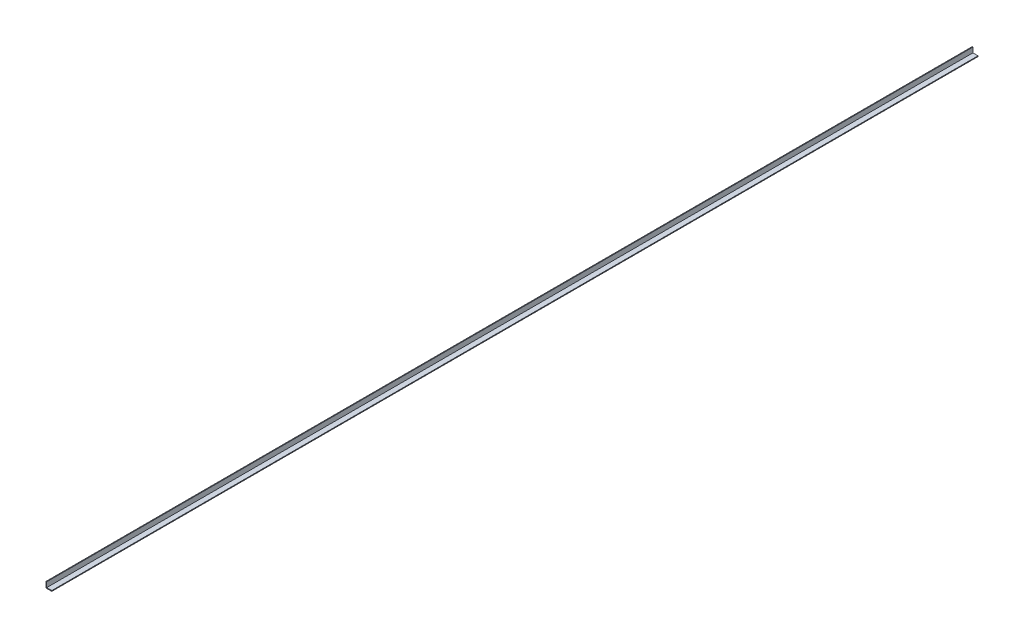
ISO-10303-21;
HEADER;
FILE_DESCRIPTION(('STEP AP214'),'2;1');
FILE_NAME('part.step','',(''),(''),'','','');
FILE_SCHEMA(('AUTOMOTIVE_DESIGN { 1 0 10303 214 1 1 1 1 }'));
ENDSEC;
DATA;
#1=APPLICATION_CONTEXT('core data for automotive mechanical design processes');
#2=APPLICATION_PROTOCOL_DEFINITION('international standard','automotive_design',2000,#1);
#3=PRODUCT_CONTEXT('',#1,'mechanical');
#4=PRODUCT('Part','Part','',(#3));
#5=PRODUCT_RELATED_PRODUCT_CATEGORY('part','',(#4));
#6=PRODUCT_DEFINITION_FORMATION('','',#4);
#7=PRODUCT_DEFINITION_CONTEXT('part definition',#1,'design');
#8=PRODUCT_DEFINITION('design','',#6,#7);
#9=PRODUCT_DEFINITION_SHAPE('','',#8);
#10=(LENGTH_UNIT() NAMED_UNIT(*) SI_UNIT(.MILLI.,.METRE.));
#11=(NAMED_UNIT(*) PLANE_ANGLE_UNIT() SI_UNIT($,.RADIAN.));
#12=(NAMED_UNIT(*) SI_UNIT($,.STERADIAN.) SOLID_ANGLE_UNIT());
#13=UNCERTAINTY_MEASURE_WITH_UNIT(LENGTH_MEASURE(1.E-05),#10,'distance_accuracy_value','');
#14=(GEOMETRIC_REPRESENTATION_CONTEXT(3) GLOBAL_UNCERTAINTY_ASSIGNED_CONTEXT((#13)) GLOBAL_UNIT_ASSIGNED_CONTEXT((#10,
#11,#12)) REPRESENTATION_CONTEXT('',''));
#15=CARTESIAN_POINT('',(0.,0.,0.));
#16=DIRECTION('',(0.,0.,1.));
#17=DIRECTION('',(1.,0.,0.));
#18=AXIS2_PLACEMENT_3D('',#15,#16,#17);
#19=CARTESIAN_POINT('',(4.76,38.1,-6100.));
#20=DIRECTION('',(0.,1.,0.));
#21=DIRECTION('',(0.,0.,1.));
#22=AXIS2_PLACEMENT_3D('',#19,#20,#21);
#23=PLANE('',#22);
#24=DIRECTION('',(-1.,0.,0.));
#25=VECTOR('',#24,1.);
#26=CARTESIAN_POINT('',(4.76,38.1,0.));
#27=LINE('',#26,#25);
#28=CARTESIAN_POINT('',(4.76,38.1,0.));
#29=VERTEX_POINT('',#28);
#30=CARTESIAN_POINT('',(0.,38.1,0.));
#31=VERTEX_POINT('',#30);
#32=EDGE_CURVE('E118',#29,#31,#27,.T.);
#33=ORIENTED_EDGE('',*,*,#32,.F.);
#34=DIRECTION('',(0.,0.,1.));
#35=VECTOR('',#34,1.);
#36=CARTESIAN_POINT('',(4.76,38.1,-6100.));
#37=LINE('',#36,#35);
#38=CARTESIAN_POINT('',(4.76,38.1,-6100.));
#39=VERTEX_POINT('',#38);
#40=EDGE_CURVE('E11',#39,#29,#37,.T.);
#41=ORIENTED_EDGE('',*,*,#40,.F.);
#42=DIRECTION('',(-1.,0.,0.));
#43=VECTOR('',#42,1.);
#44=CARTESIAN_POINT('',(4.76,38.1,-6100.));
#45=LINE('',#44,#43);
#46=CARTESIAN_POINT('',(0.,38.1,-6100.));
#47=VERTEX_POINT('',#46);
#48=EDGE_CURVE('E132',#39,#47,#45,.T.);
#49=ORIENTED_EDGE('',*,*,#48,.T.);
#50=DIRECTION('',(0.,0.,1.));
#51=VECTOR('',#50,1.);
#52=CARTESIAN_POINT('',(0.,38.1,-6100.));
#53=LINE('',#52,#51);
#54=EDGE_CURVE('E36',#47,#31,#53,.T.);
#55=ORIENTED_EDGE('',*,*,#54,.T.);
#56=EDGE_LOOP('',(#33,#41,#49,#55));
#57=FACE_BOUND('',#56,.T.);
#58=ADVANCED_FACE('F33',(#57),#23,.T.);
#59=CARTESIAN_POINT('',(4.76,4.76,-6100.));
#60=DIRECTION('',(1.,0.,0.));
#61=DIRECTION('',(0.,1.,0.));
#62=AXIS2_PLACEMENT_3D('',#59,#60,#61);
#63=PLANE('',#62);
#64=DIRECTION('',(0.,1.,0.));
#65=VECTOR('',#64,1.);
#66=CARTESIAN_POINT('',(4.76,4.76,0.));
#67=LINE('',#66,#65);
#68=CARTESIAN_POINT('',(4.76,4.76,0.));
#69=VERTEX_POINT('',#68);
#70=EDGE_CURVE('E130',#69,#29,#67,.T.);
#71=ORIENTED_EDGE('',*,*,#70,.F.);
#72=DIRECTION('',(0.,0.,1.));
#73=VECTOR('',#72,1.);
#74=CARTESIAN_POINT('',(4.76,4.76,-6100.));
#75=LINE('',#74,#73);
#76=CARTESIAN_POINT('',(4.76,4.76,-6100.));
#77=VERTEX_POINT('',#76);
#78=EDGE_CURVE('E42',#77,#69,#75,.T.);
#79=ORIENTED_EDGE('',*,*,#78,.F.);
#80=DIRECTION('',(0.,1.,0.));
#81=VECTOR('',#80,1.);
#82=CARTESIAN_POINT('',(4.76,4.76,-6100.));
#83=LINE('',#82,#81);
#84=EDGE_CURVE('E108',#77,#39,#83,.T.);
#85=ORIENTED_EDGE('',*,*,#84,.T.);
#86=ORIENTED_EDGE('',*,*,#40,.T.);
#87=EDGE_LOOP('',(#71,#79,#85,#86));
#88=FACE_BOUND('',#87,.T.);
#89=ADVANCED_FACE('F140',(#88),#63,.T.);
#90=CARTESIAN_POINT('',(38.1,4.76,-6100.));
#91=DIRECTION('',(0.,1.,0.));
#92=DIRECTION('',(-1.,0.,0.));
#93=AXIS2_PLACEMENT_3D('',#90,#91,#92);
#94=PLANE('',#93);
#95=DIRECTION('',(-1.,0.,0.));
#96=VECTOR('',#95,1.);
#97=CARTESIAN_POINT('',(38.1,4.76,0.));
#98=LINE('',#97,#96);
#99=CARTESIAN_POINT('',(38.1,4.76,0.));
#100=VERTEX_POINT('',#99);
#101=EDGE_CURVE('E95',#100,#69,#98,.T.);
#102=ORIENTED_EDGE('',*,*,#101,.F.);
#103=DIRECTION('',(0.,0.,1.));
#104=VECTOR('',#103,1.);
#105=CARTESIAN_POINT('',(38.1,4.76,-6100.));
#106=LINE('',#105,#104);
#107=CARTESIAN_POINT('',(38.1,4.76,-6100.));
#108=VERTEX_POINT('',#107);
#109=EDGE_CURVE('E90',#108,#100,#106,.T.);
#110=ORIENTED_EDGE('',*,*,#109,.F.);
#111=DIRECTION('',(-1.,0.,0.));
#112=VECTOR('',#111,1.);
#113=CARTESIAN_POINT('',(38.1,4.76,-6100.));
#114=LINE('',#113,#112);
#115=EDGE_CURVE('E93',#108,#77,#114,.T.);
#116=ORIENTED_EDGE('',*,*,#115,.T.);
#117=ORIENTED_EDGE('',*,*,#78,.T.);
#118=EDGE_LOOP('',(#102,#110,#116,#117));
#119=FACE_BOUND('',#118,.T.);
#120=ADVANCED_FACE('F92',(#119),#94,.T.);
#121=CARTESIAN_POINT('',(38.1,0.,-6100.));
#122=DIRECTION('',(1.,0.,0.));
#123=DIRECTION('',(0.,0.,-1.));
#124=AXIS2_PLACEMENT_3D('',#121,#122,#123);
#125=PLANE('',#124);
#126=DIRECTION('',(0.,1.,0.));
#127=VECTOR('',#126,1.);
#128=CARTESIAN_POINT('',(38.1,0.,0.));
#129=LINE('',#128,#127);
#130=CARTESIAN_POINT('',(38.1,0.,0.));
#131=VERTEX_POINT('',#130);
#132=EDGE_CURVE('E127',#131,#100,#129,.T.);
#133=ORIENTED_EDGE('',*,*,#132,.F.);
#134=DIRECTION('',(0.,0.,1.));
#135=VECTOR('',#134,1.);
#136=CARTESIAN_POINT('',(38.1,0.,-6100.));
#137=LINE('',#136,#135);
#138=CARTESIAN_POINT('',(38.1,0.,-6100.));
#139=VERTEX_POINT('',#138);
#140=EDGE_CURVE('E100',#139,#131,#137,.T.);
#141=ORIENTED_EDGE('',*,*,#140,.F.);
#142=DIRECTION('',(0.,1.,0.));
#143=VECTOR('',#142,1.);
#144=CARTESIAN_POINT('',(38.1,0.,-6100.));
#145=LINE('',#144,#143);
#146=EDGE_CURVE('E106',#139,#108,#145,.T.);
#147=ORIENTED_EDGE('',*,*,#146,.T.);
#148=ORIENTED_EDGE('',*,*,#109,.T.);
#149=EDGE_LOOP('',(#133,#141,#147,#148));
#150=FACE_BOUND('',#149,.T.);
#151=ADVANCED_FACE('F110',(#150),#125,.T.);
#152=CARTESIAN_POINT('',(0.,0.,-6100.));
#153=DIRECTION('',(0.,-1.,0.));
#154=DIRECTION('',(0.,0.,-1.));
#155=AXIS2_PLACEMENT_3D('',#152,#153,#154);
#156=PLANE('',#155);
#157=DIRECTION('',(1.,0.,0.));
#158=VECTOR('',#157,1.);
#159=CARTESIAN_POINT('',(0.,0.,0.));
#160=LINE('',#159,#158);
#161=CARTESIAN_POINT('',(0.,0.,0.));
#162=VERTEX_POINT('',#161);
#163=EDGE_CURVE('E124',#162,#131,#160,.T.);
#164=ORIENTED_EDGE('',*,*,#163,.F.);
#165=DIRECTION('',(0.,0.,1.));
#166=VECTOR('',#165,1.);
#167=CARTESIAN_POINT('',(0.,0.,-6100.));
#168=LINE('',#167,#166);
#169=CARTESIAN_POINT('',(0.,0.,-6100.));
#170=VERTEX_POINT('',#169);
#171=EDGE_CURVE('E135',#170,#162,#168,.T.);
#172=ORIENTED_EDGE('',*,*,#171,.F.);
#173=DIRECTION('',(1.,0.,0.));
#174=VECTOR('',#173,1.);
#175=CARTESIAN_POINT('',(0.,0.,-6100.));
#176=LINE('',#175,#174);
#177=EDGE_CURVE('E111',#170,#139,#176,.T.);
#178=ORIENTED_EDGE('',*,*,#177,.T.);
#179=ORIENTED_EDGE('',*,*,#140,.T.);
#180=EDGE_LOOP('',(#164,#172,#178,#179));
#181=FACE_BOUND('',#180,.T.);
#182=ADVANCED_FACE('F153',(#181),#156,.T.);
#183=CARTESIAN_POINT('',(0.,38.1,-6100.));
#184=DIRECTION('',(-1.,0.,0.));
#185=DIRECTION('',(0.,-1.,0.));
#186=AXIS2_PLACEMENT_3D('',#183,#184,#185);
#187=PLANE('',#186);
#188=DIRECTION('',(0.,-1.,0.));
#189=VECTOR('',#188,1.);
#190=CARTESIAN_POINT('',(0.,38.1,0.));
#191=LINE('',#190,#189);
#192=EDGE_CURVE('E121',#31,#162,#191,.T.);
#193=ORIENTED_EDGE('',*,*,#192,.F.);
#194=ORIENTED_EDGE('',*,*,#54,.F.);
#195=DIRECTION('',(0.,-1.,0.));
#196=VECTOR('',#195,1.);
#197=CARTESIAN_POINT('',(0.,38.1,-6100.));
#198=LINE('',#197,#196);
#199=EDGE_CURVE('E113',#47,#170,#198,.T.);
#200=ORIENTED_EDGE('',*,*,#199,.T.);
#201=ORIENTED_EDGE('',*,*,#171,.T.);
#202=EDGE_LOOP('',(#193,#194,#200,#201));
#203=FACE_BOUND('',#202,.T.);
#204=ADVANCED_FACE('F137',(#203),#187,.T.);
#205=CARTESIAN_POINT('',(0.,0.,-6100.));
#206=DIRECTION('',(0.,0.,1.));
#207=DIRECTION('',(1.,0.,0.));
#208=AXIS2_PLACEMENT_3D('',#205,#206,#207);
#209=PLANE('',#208);
#210=ORIENTED_EDGE('',*,*,#48,.F.);
#211=ORIENTED_EDGE('',*,*,#84,.F.);
#212=ORIENTED_EDGE('',*,*,#115,.F.);
#213=ORIENTED_EDGE('',*,*,#146,.F.);
#214=ORIENTED_EDGE('',*,*,#177,.F.);
#215=ORIENTED_EDGE('',*,*,#199,.F.);
#216=EDGE_LOOP('',(#210,#211,#212,#213,#214,#215));
#217=FACE_BOUND('',#216,.T.);
#218=ADVANCED_FACE('F104',(#217),#209,.F.);
#219=CARTESIAN_POINT('',(0.,0.,0.));
#220=DIRECTION('',(0.,0.,1.));
#221=DIRECTION('',(1.,0.,0.));
#222=AXIS2_PLACEMENT_3D('',#219,#220,#221);
#223=PLANE('',#222);
#224=ORIENTED_EDGE('',*,*,#32,.T.);
#225=ORIENTED_EDGE('',*,*,#192,.T.);
#226=ORIENTED_EDGE('',*,*,#163,.T.);
#227=ORIENTED_EDGE('',*,*,#132,.T.);
#228=ORIENTED_EDGE('',*,*,#101,.T.);
#229=ORIENTED_EDGE('',*,*,#70,.T.);
#230=EDGE_LOOP('',(#224,#225,#226,#227,#228,#229));
#231=FACE_BOUND('',#230,.T.);
#232=ADVANCED_FACE('F139',(#231),#223,.T.);
#233=CLOSED_SHELL('',(#58,#89,#120,#151,#182,#204,#218,#232));
#234=MANIFOLD_SOLID_BREP('B2',#233);
#235=ADVANCED_BREP_SHAPE_REPRESENTATION('',(#18,#234),#14);
#236=SHAPE_DEFINITION_REPRESENTATION(#9,#235);
ENDSEC;
END-ISO-10303-21;
